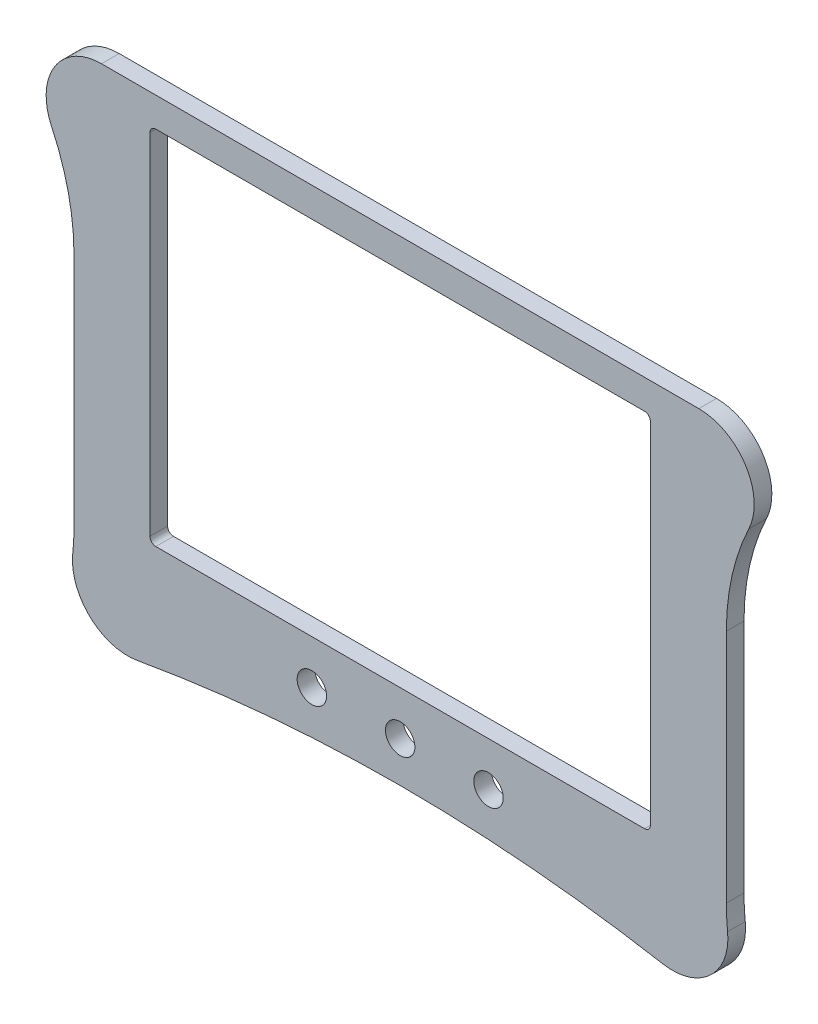
ISO-10303-21;
HEADER;
FILE_DESCRIPTION(('STEP AP214'),'2;1');
FILE_NAME('part.step','',(''),(''),'','','');
FILE_SCHEMA(('AUTOMOTIVE_DESIGN { 1 0 10303 214 1 1 1 1 }'));
ENDSEC;
DATA;
#1=APPLICATION_CONTEXT('core data for automotive mechanical design processes');
#2=APPLICATION_PROTOCOL_DEFINITION('international standard','automotive_design',2000,#1);
#3=PRODUCT_CONTEXT('',#1,'mechanical');
#4=PRODUCT('Part','Part','',(#3));
#5=PRODUCT_RELATED_PRODUCT_CATEGORY('part','',(#4));
#6=PRODUCT_DEFINITION_FORMATION('','',#4);
#7=PRODUCT_DEFINITION_CONTEXT('part definition',#1,'design');
#8=PRODUCT_DEFINITION('design','',#6,#7);
#9=PRODUCT_DEFINITION_SHAPE('','',#8);
#10=(LENGTH_UNIT() NAMED_UNIT(*) SI_UNIT(.MILLI.,.METRE.));
#11=(NAMED_UNIT(*) PLANE_ANGLE_UNIT() SI_UNIT($,.RADIAN.));
#12=(NAMED_UNIT(*) SI_UNIT($,.STERADIAN.) SOLID_ANGLE_UNIT());
#13=UNCERTAINTY_MEASURE_WITH_UNIT(LENGTH_MEASURE(1.E-05),#10,'distance_accuracy_value','');
#14=(GEOMETRIC_REPRESENTATION_CONTEXT(3) GLOBAL_UNCERTAINTY_ASSIGNED_CONTEXT((#13)) GLOBAL_UNIT_ASSIGNED_CONTEXT((#10,
#11,#12)) REPRESENTATION_CONTEXT('',''));
#15=CARTESIAN_POINT('',(0.,0.,0.));
#16=DIRECTION('',(0.,0.,1.));
#17=DIRECTION('',(1.,0.,0.));
#18=AXIS2_PLACEMENT_3D('',#15,#16,#17);
#19=CARTESIAN_POINT('',(120.65,337.34375,3.81));
#20=DIRECTION('',(0.,0.,-1.));
#21=DIRECTION('',(-1.,0.,0.));
#22=AXIS2_PLACEMENT_3D('',#19,#20,#21);
#23=CYLINDRICAL_SURFACE('',#22,50.292);
#24=CARTESIAN_POINT('',(120.65,337.34375,0.));
#25=DIRECTION('',(0.,0.,-1.));
#26=DIRECTION('',(1.,0.,0.));
#27=AXIS2_PLACEMENT_3D('',#24,#25,#26);
#28=CIRCLE('',#27,50.292);
#29=CARTESIAN_POINT('',(70.6285165313798,332.134483679437,0.));
#30=VERTEX_POINT('',#29);
#31=CARTESIAN_POINT('',(70.358,337.34375,0.));
#32=VERTEX_POINT('',#31);
#33=EDGE_CURVE('E243',#30,#32,#28,.T.);
#34=ORIENTED_EDGE('',*,*,#33,.T.);
#35=DIRECTION('',(0.,0.,-1.));
#36=VECTOR('',#35,1.);
#37=CARTESIAN_POINT('',(70.358,337.34375,3.81));
#38=LINE('',#37,#36);
#39=CARTESIAN_POINT('',(70.358,337.34375,3.81));
#40=VERTEX_POINT('',#39);
#41=EDGE_CURVE('E11',#40,#32,#38,.T.);
#42=ORIENTED_EDGE('',*,*,#41,.F.);
#43=CARTESIAN_POINT('',(120.65,337.34375,3.81));
#44=DIRECTION('',(0.,0.,-1.));
#45=DIRECTION('',(1.,0.,0.));
#46=AXIS2_PLACEMENT_3D('',#43,#44,#45);
#47=CIRCLE('',#46,50.292);
#48=CARTESIAN_POINT('',(70.6285165313798,332.134483679437,3.81));
#49=VERTEX_POINT('',#48);
#50=EDGE_CURVE('E248',#49,#40,#47,.T.);
#51=ORIENTED_EDGE('',*,*,#50,.F.);
#52=DIRECTION('',(0.,0.,-1.));
#53=VECTOR('',#52,1.);
#54=CARTESIAN_POINT('',(70.6285165313798,332.134483679437,3.81));
#55=LINE('',#54,#53);
#56=EDGE_CURVE('E274',#49,#30,#55,.T.);
#57=ORIENTED_EDGE('',*,*,#56,.T.);
#58=EDGE_LOOP('',(#34,#42,#51,#57));
#59=FACE_BOUND('',#58,.T.);
#60=ADVANCED_FACE('F33',(#59),#23,.F.);
#61=CARTESIAN_POINT('',(70.358,337.34375,3.81));
#62=DIRECTION('',(-1.,0.,0.));
#63=DIRECTION('',(0.,0.,1.));
#64=AXIS2_PLACEMENT_3D('',#61,#62,#63);
#65=PLANE('',#64);
#66=DIRECTION('',(0.,1.,0.));
#67=VECTOR('',#66,1.);
#68=CARTESIAN_POINT('',(70.358,337.34375,0.));
#69=LINE('',#68,#67);
#70=CARTESIAN_POINT('',(70.358,388.14375,0.));
#71=VERTEX_POINT('',#70);
#72=EDGE_CURVE('E277',#32,#71,#69,.T.);
#73=ORIENTED_EDGE('',*,*,#72,.T.);
#74=DIRECTION('',(0.,0.,-1.));
#75=VECTOR('',#74,1.);
#76=CARTESIAN_POINT('',(70.358,388.14375,3.81));
#77=LINE('',#76,#75);
#78=CARTESIAN_POINT('',(70.358,388.14375,3.81));
#79=VERTEX_POINT('',#78);
#80=EDGE_CURVE('E40',#79,#71,#77,.T.);
#81=ORIENTED_EDGE('',*,*,#80,.F.);
#82=DIRECTION('',(0.,1.,0.));
#83=VECTOR('',#82,1.);
#84=CARTESIAN_POINT('',(70.358,337.34375,3.81));
#85=LINE('',#84,#83);
#86=EDGE_CURVE('E251',#40,#79,#85,.T.);
#87=ORIENTED_EDGE('',*,*,#86,.F.);
#88=ORIENTED_EDGE('',*,*,#41,.T.);
#89=EDGE_LOOP('',(#73,#81,#87,#88));
#90=FACE_BOUND('',#89,.T.);
#91=ADVANCED_FACE('F353',(#90),#65,.F.);
#92=CARTESIAN_POINT('',(120.65,388.14375,3.81));
#93=DIRECTION('',(0.,0.,-1.));
#94=DIRECTION('',(-1.,0.,0.));
#95=AXIS2_PLACEMENT_3D('',#92,#93,#94);
#96=CYLINDRICAL_SURFACE('',#95,50.292);
#97=CARTESIAN_POINT('',(120.65,388.14375,0.));
#98=DIRECTION('',(0.,0.,-1.));
#99=DIRECTION('',(1.,0.,0.));
#100=AXIS2_PLACEMENT_3D('',#97,#98,#99);
#101=CIRCLE('',#100,50.292);
#102=CARTESIAN_POINT('',(75.2107805470892,409.697464285714,0.));
#103=VERTEX_POINT('',#102);
#104=EDGE_CURVE('E279',#71,#103,#101,.T.);
#105=ORIENTED_EDGE('',*,*,#104,.T.);
#106=DIRECTION('',(0.,0.,-1.));
#107=VECTOR('',#106,1.);
#108=CARTESIAN_POINT('',(75.2107805470892,409.697464285714,3.81));
#109=LINE('',#108,#107);
#110=CARTESIAN_POINT('',(75.2107805470892,409.697464285714,3.81));
#111=VERTEX_POINT('',#110);
#112=EDGE_CURVE('E324',#111,#103,#109,.T.);
#113=ORIENTED_EDGE('',*,*,#112,.F.);
#114=CARTESIAN_POINT('',(120.65,388.14375,3.81));
#115=DIRECTION('',(0.,0.,-1.));
#116=DIRECTION('',(1.,0.,0.));
#117=AXIS2_PLACEMENT_3D('',#114,#115,#116);
#118=CIRCLE('',#117,50.292);
#119=EDGE_CURVE('E254',#79,#111,#118,.T.);
#120=ORIENTED_EDGE('',*,*,#119,.F.);
#121=ORIENTED_EDGE('',*,*,#80,.T.);
#122=EDGE_LOOP('',(#105,#113,#120,#121));
#123=FACE_BOUND('',#122,.T.);
#124=ADVANCED_FACE('F331',(#123),#96,.F.);
#125=CARTESIAN_POINT('',(64.4247032022062,414.81375,3.81));
#126=DIRECTION('',(0.,0.,-1.));
#127=DIRECTION('',(-1.,0.,0.));
#128=AXIS2_PLACEMENT_3D('',#125,#126,#127);
#129=CYLINDRICAL_SURFACE('',#128,11.938);
#130=CARTESIAN_POINT('',(64.4247032022062,414.81375,0.));
#131=DIRECTION('',(0.,0.,1.));
#132=DIRECTION('',(1.,0.,0.));
#133=AXIS2_PLACEMENT_3D('',#130,#131,#132);
#134=CIRCLE('',#133,11.938);
#135=CARTESIAN_POINT('',(64.4247032022062,426.75175,0.));
#136=VERTEX_POINT('',#135);
#137=EDGE_CURVE('E281',#103,#136,#134,.T.);
#138=ORIENTED_EDGE('',*,*,#137,.T.);
#139=DIRECTION('',(0.,0.,-1.));
#140=VECTOR('',#139,1.);
#141=CARTESIAN_POINT('',(64.4247032022062,426.75175,3.81));
#142=LINE('',#141,#140);
#143=CARTESIAN_POINT('',(64.4247032022062,426.75175,3.81));
#144=VERTEX_POINT('',#143);
#145=EDGE_CURVE('E321',#144,#136,#142,.T.);
#146=ORIENTED_EDGE('',*,*,#145,.F.);
#147=CARTESIAN_POINT('',(64.4247032022062,414.81375,3.81));
#148=DIRECTION('',(0.,0.,1.));
#149=DIRECTION('',(1.,0.,0.));
#150=AXIS2_PLACEMENT_3D('',#147,#148,#149);
#151=CIRCLE('',#150,11.938);
#152=EDGE_CURVE('E256',#111,#144,#151,.T.);
#153=ORIENTED_EDGE('',*,*,#152,.F.);
#154=ORIENTED_EDGE('',*,*,#112,.T.);
#155=EDGE_LOOP('',(#138,#146,#153,#154));
#156=FACE_BOUND('',#155,.T.);
#157=ADVANCED_FACE('F341',(#156),#129,.T.);
#158=CARTESIAN_POINT('',(64.4247032022062,426.75175,3.81));
#159=DIRECTION('',(0.,-1.,0.));
#160=DIRECTION('',(1.,0.,0.));
#161=AXIS2_PLACEMENT_3D('',#158,#159,#160);
#162=PLANE('',#161);
#163=DIRECTION('',(-1.,0.,0.));
#164=VECTOR('',#163,1.);
#165=CARTESIAN_POINT('',(64.4247032022062,426.75175,0.));
#166=LINE('',#165,#164);
#167=CARTESIAN_POINT('',(-64.4247032022062,426.75175,0.));
#168=VERTEX_POINT('',#167);
#169=EDGE_CURVE('E283',#136,#168,#166,.T.);
#170=ORIENTED_EDGE('',*,*,#169,.T.);
#171=DIRECTION('',(0.,0.,-1.));
#172=VECTOR('',#171,1.);
#173=CARTESIAN_POINT('',(-64.4247032022062,426.75175,3.81));
#174=LINE('',#173,#172);
#175=CARTESIAN_POINT('',(-64.4247032022062,426.75175,3.81));
#176=VERTEX_POINT('',#175);
#177=EDGE_CURVE('E318',#176,#168,#174,.T.);
#178=ORIENTED_EDGE('',*,*,#177,.F.);
#179=DIRECTION('',(-1.,0.,0.));
#180=VECTOR('',#179,1.);
#181=CARTESIAN_POINT('',(64.4247032022062,426.75175,3.81));
#182=LINE('',#181,#180);
#183=EDGE_CURVE('E258',#144,#176,#182,.T.);
#184=ORIENTED_EDGE('',*,*,#183,.F.);
#185=ORIENTED_EDGE('',*,*,#145,.T.);
#186=EDGE_LOOP('',(#170,#178,#184,#185));
#187=FACE_BOUND('',#186,.T.);
#188=ADVANCED_FACE('F345',(#187),#162,.F.);
#189=CARTESIAN_POINT('',(-64.4247032022062,414.81375,3.81));
#190=DIRECTION('',(0.,0.,-1.));
#191=DIRECTION('',(-1.,0.,0.));
#192=AXIS2_PLACEMENT_3D('',#189,#190,#191);
#193=CYLINDRICAL_SURFACE('',#192,11.938);
#194=CARTESIAN_POINT('',(-64.4247032022062,414.81375,0.));
#195=DIRECTION('',(0.,0.,1.));
#196=DIRECTION('',(-1.,0.,0.));
#197=AXIS2_PLACEMENT_3D('',#194,#195,#196);
#198=CIRCLE('',#197,11.938);
#199=CARTESIAN_POINT('',(-75.2107805470892,409.697464285714,0.));
#200=VERTEX_POINT('',#199);
#201=EDGE_CURVE('E285',#168,#200,#198,.T.);
#202=ORIENTED_EDGE('',*,*,#201,.T.);
#203=DIRECTION('',(0.,0.,-1.));
#204=VECTOR('',#203,1.);
#205=CARTESIAN_POINT('',(-75.2107805470892,409.697464285714,3.81));
#206=LINE('',#205,#204);
#207=CARTESIAN_POINT('',(-75.2107805470892,409.697464285714,3.81));
#208=VERTEX_POINT('',#207);
#209=EDGE_CURVE('E315',#208,#200,#206,.T.);
#210=ORIENTED_EDGE('',*,*,#209,.F.);
#211=CARTESIAN_POINT('',(-64.4247032022062,414.81375,3.81));
#212=DIRECTION('',(0.,0.,1.));
#213=DIRECTION('',(-1.,0.,0.));
#214=AXIS2_PLACEMENT_3D('',#211,#212,#213);
#215=CIRCLE('',#214,11.938);
#216=EDGE_CURVE('E260',#176,#208,#215,.T.);
#217=ORIENTED_EDGE('',*,*,#216,.F.);
#218=ORIENTED_EDGE('',*,*,#177,.T.);
#219=EDGE_LOOP('',(#202,#210,#217,#218));
#220=FACE_BOUND('',#219,.T.);
#221=ADVANCED_FACE('F386',(#220),#193,.T.);
#222=CARTESIAN_POINT('',(-120.65,388.14375,3.81));
#223=DIRECTION('',(0.,0.,-1.));
#224=DIRECTION('',(-1.,0.,0.));
#225=AXIS2_PLACEMENT_3D('',#222,#223,#224);
#226=CYLINDRICAL_SURFACE('',#225,50.2919999999999);
#227=CARTESIAN_POINT('',(-120.65,388.14375,0.));
#228=DIRECTION('',(0.,0.,-1.));
#229=DIRECTION('',(1.,0.,0.));
#230=AXIS2_PLACEMENT_3D('',#227,#228,#229);
#231=CIRCLE('',#230,50.2919999999999);
#232=CARTESIAN_POINT('',(-70.358,388.14375,0.));
#233=VERTEX_POINT('',#232);
#234=EDGE_CURVE('E287',#200,#233,#231,.T.);
#235=ORIENTED_EDGE('',*,*,#234,.T.);
#236=DIRECTION('',(0.,0.,-1.));
#237=VECTOR('',#236,1.);
#238=CARTESIAN_POINT('',(-70.358,388.14375,3.81));
#239=LINE('',#238,#237);
#240=CARTESIAN_POINT('',(-70.358,388.14375,3.81));
#241=VERTEX_POINT('',#240);
#242=EDGE_CURVE('E312',#241,#233,#239,.T.);
#243=ORIENTED_EDGE('',*,*,#242,.F.);
#244=CARTESIAN_POINT('',(-120.65,388.14375,3.81));
#245=DIRECTION('',(0.,0.,-1.));
#246=DIRECTION('',(1.,0.,0.));
#247=AXIS2_PLACEMENT_3D('',#244,#245,#246);
#248=CIRCLE('',#247,50.2919999999999);
#249=EDGE_CURVE('E262',#208,#241,#248,.T.);
#250=ORIENTED_EDGE('',*,*,#249,.F.);
#251=ORIENTED_EDGE('',*,*,#209,.T.);
#252=EDGE_LOOP('',(#235,#243,#250,#251));
#253=FACE_BOUND('',#252,.T.);
#254=ADVANCED_FACE('F384',(#253),#226,.F.);
#255=CARTESIAN_POINT('',(-70.358,388.14375,3.81));
#256=DIRECTION('',(1.,0.,0.));
#257=DIRECTION('',(0.,0.,-1.));
#258=AXIS2_PLACEMENT_3D('',#255,#256,#257);
#259=PLANE('',#258);
#260=DIRECTION('',(0.,-1.,0.));
#261=VECTOR('',#260,1.);
#262=CARTESIAN_POINT('',(-70.358,388.14375,0.));
#263=LINE('',#262,#261);
#264=CARTESIAN_POINT('',(-70.358,337.34375,0.));
#265=VERTEX_POINT('',#264);
#266=EDGE_CURVE('E289',#233,#265,#263,.T.);
#267=ORIENTED_EDGE('',*,*,#266,.T.);
#268=DIRECTION('',(0.,0.,-1.));
#269=VECTOR('',#268,1.);
#270=CARTESIAN_POINT('',(-70.358,337.34375,3.81));
#271=LINE('',#270,#269);
#272=CARTESIAN_POINT('',(-70.358,337.34375,3.81));
#273=VERTEX_POINT('',#272);
#274=EDGE_CURVE('E309',#273,#265,#271,.T.);
#275=ORIENTED_EDGE('',*,*,#274,.F.);
#276=DIRECTION('',(0.,-1.,0.));
#277=VECTOR('',#276,1.);
#278=CARTESIAN_POINT('',(-70.358,388.14375,3.81));
#279=LINE('',#278,#277);
#280=EDGE_CURVE('E264',#241,#273,#279,.T.);
#281=ORIENTED_EDGE('',*,*,#280,.F.);
#282=ORIENTED_EDGE('',*,*,#242,.T.);
#283=EDGE_LOOP('',(#267,#275,#281,#282));
#284=FACE_BOUND('',#283,.T.);
#285=ADVANCED_FACE('F380',(#284),#259,.F.);
#286=CARTESIAN_POINT('',(-120.65,337.34375,3.81));
#287=DIRECTION('',(0.,0.,-1.));
#288=DIRECTION('',(-1.,0.,0.));
#289=AXIS2_PLACEMENT_3D('',#286,#287,#288);
#290=CYLINDRICAL_SURFACE('',#289,50.292);
#291=CARTESIAN_POINT('',(-120.65,337.34375,0.));
#292=DIRECTION('',(0.,0.,-1.));
#293=DIRECTION('',(1.,0.,0.));
#294=AXIS2_PLACEMENT_3D('',#291,#292,#293);
#295=CIRCLE('',#294,50.292);
#296=CARTESIAN_POINT('',(-70.6285165313798,332.134483679437,0.));
#297=VERTEX_POINT('',#296);
#298=EDGE_CURVE('E291',#265,#297,#295,.T.);
#299=ORIENTED_EDGE('',*,*,#298,.T.);
#300=DIRECTION('',(0.,0.,-1.));
#301=VECTOR('',#300,1.);
#302=CARTESIAN_POINT('',(-70.6285165313798,332.134483679437,3.81));
#303=LINE('',#302,#301);
#304=CARTESIAN_POINT('',(-70.6285165313798,332.134483679437,3.81));
#305=VERTEX_POINT('',#304);
#306=EDGE_CURVE('E306',#305,#297,#303,.T.);
#307=ORIENTED_EDGE('',*,*,#306,.F.);
#308=CARTESIAN_POINT('',(-120.65,337.34375,3.81));
#309=DIRECTION('',(0.,0.,-1.));
#310=DIRECTION('',(1.,0.,0.));
#311=AXIS2_PLACEMENT_3D('',#308,#309,#310);
#312=CIRCLE('',#311,50.292);
#313=EDGE_CURVE('E266',#273,#305,#312,.T.);
#314=ORIENTED_EDGE('',*,*,#313,.F.);
#315=ORIENTED_EDGE('',*,*,#274,.T.);
#316=EDGE_LOOP('',(#299,#307,#314,#315));
#317=FACE_BOUND('',#316,.T.);
#318=ADVANCED_FACE('F375',(#317),#290,.F.);
#319=CARTESIAN_POINT('',(-58.7547300514547,330.89794066395,3.81));
#320=DIRECTION('',(0.,0.,-1.));
#321=DIRECTION('',(-1.,0.,0.));
#322=AXIS2_PLACEMENT_3D('',#319,#320,#321);
#323=CYLINDRICAL_SURFACE('',#322,11.938);
#324=CARTESIAN_POINT('',(-58.7547300514547,330.89794066395,0.));
#325=DIRECTION('',(0.,0.,1.));
#326=DIRECTION('',(-1.,0.,0.));
#327=AXIS2_PLACEMENT_3D('',#324,#325,#326);
#328=CIRCLE('',#327,11.938);
#329=CARTESIAN_POINT('',(-56.6676465843459,319.143795582264,0.));
#330=VERTEX_POINT('',#329);
#331=EDGE_CURVE('E293',#297,#330,#328,.T.);
#332=ORIENTED_EDGE('',*,*,#331,.T.);
#333=DIRECTION('',(0.,0.,-1.));
#334=VECTOR('',#333,1.);
#335=CARTESIAN_POINT('',(-56.6676465843459,319.143795582264,3.81));
#336=LINE('',#335,#334);
#337=CARTESIAN_POINT('',(-56.6676465843459,319.143795582264,3.81));
#338=VERTEX_POINT('',#337);
#339=EDGE_CURVE('E303',#338,#330,#336,.T.);
#340=ORIENTED_EDGE('',*,*,#339,.F.);
#341=CARTESIAN_POINT('',(-58.7547300514547,330.89794066395,3.81));
#342=DIRECTION('',(0.,0.,1.));
#343=DIRECTION('',(-1.,0.,0.));
#344=AXIS2_PLACEMENT_3D('',#341,#342,#343);
#345=CIRCLE('',#344,11.938);
#346=EDGE_CURVE('E268',#305,#338,#345,.T.);
#347=ORIENTED_EDGE('',*,*,#346,.F.);
#348=ORIENTED_EDGE('',*,*,#306,.T.);
#349=EDGE_LOOP('',(#332,#340,#347,#348));
#350=FACE_BOUND('',#349,.T.);
#351=ADVANCED_FACE('F369',(#350),#323,.T.);
#352=CARTESIAN_POINT('',(0.,0.,3.81));
#353=DIRECTION('',(0.,0.,-1.));
#354=DIRECTION('',(-1.,0.,0.));
#355=AXIS2_PLACEMENT_3D('',#352,#353,#354);
#356=CYLINDRICAL_SURFACE('',#355,324.13575);
#357=CARTESIAN_POINT('',(0.,0.,0.));
#358=DIRECTION('',(0.,0.,-1.));
#359=DIRECTION('',(1.,0.,0.));
#360=AXIS2_PLACEMENT_3D('',#357,#358,#359);
#361=CIRCLE('',#360,324.13575);
#362=CARTESIAN_POINT('',(56.6676465843459,319.143795582264,0.));
#363=VERTEX_POINT('',#362);
#364=EDGE_CURVE('E295',#330,#363,#361,.T.);
#365=ORIENTED_EDGE('',*,*,#364,.T.);
#366=DIRECTION('',(0.,0.,-1.));
#367=VECTOR('',#366,1.);
#368=CARTESIAN_POINT('',(56.6676465843459,319.143795582264,3.81));
#369=LINE('',#368,#367);
#370=CARTESIAN_POINT('',(56.6676465843459,319.143795582264,3.81));
#371=VERTEX_POINT('',#370);
#372=EDGE_CURVE('E300',#371,#363,#369,.T.);
#373=ORIENTED_EDGE('',*,*,#372,.F.);
#374=CARTESIAN_POINT('',(0.,0.,3.81));
#375=DIRECTION('',(0.,0.,-1.));
#376=DIRECTION('',(1.,0.,0.));
#377=AXIS2_PLACEMENT_3D('',#374,#375,#376);
#378=CIRCLE('',#377,324.13575);
#379=EDGE_CURVE('E270',#338,#371,#378,.T.);
#380=ORIENTED_EDGE('',*,*,#379,.F.);
#381=ORIENTED_EDGE('',*,*,#339,.T.);
#382=EDGE_LOOP('',(#365,#373,#380,#381));
#383=FACE_BOUND('',#382,.T.);
#384=ADVANCED_FACE('F365',(#383),#356,.F.);
#385=CARTESIAN_POINT('',(58.7547300514547,330.89794066395,3.81));
#386=DIRECTION('',(0.,0.,-1.));
#387=DIRECTION('',(-1.,0.,0.));
#388=AXIS2_PLACEMENT_3D('',#385,#386,#387);
#389=CYLINDRICAL_SURFACE('',#388,11.938);
#390=CARTESIAN_POINT('',(58.7547300514547,330.89794066395,0.));
#391=DIRECTION('',(0.,0.,1.));
#392=DIRECTION('',(-1.,0.,0.));
#393=AXIS2_PLACEMENT_3D('',#390,#391,#392);
#394=CIRCLE('',#393,11.938);
#395=EDGE_CURVE('E252',#363,#30,#394,.T.);
#396=ORIENTED_EDGE('',*,*,#395,.T.);
#397=ORIENTED_EDGE('',*,*,#56,.F.);
#398=CARTESIAN_POINT('',(58.7547300514547,330.89794066395,3.81));
#399=DIRECTION('',(0.,0.,1.));
#400=DIRECTION('',(-1.,0.,0.));
#401=AXIS2_PLACEMENT_3D('',#398,#399,#400);
#402=CIRCLE('',#401,11.938);
#403=EDGE_CURVE('E272',#371,#49,#402,.T.);
#404=ORIENTED_EDGE('',*,*,#403,.F.);
#405=ORIENTED_EDGE('',*,*,#372,.T.);
#406=EDGE_LOOP('',(#396,#397,#404,#405));
#407=FACE_BOUND('',#406,.T.);
#408=ADVANCED_FACE('F360',(#407),#389,.T.);
#409=CARTESIAN_POINT('',(120.65,337.34375,3.81));
#410=DIRECTION('',(0.,0.,1.));
#411=DIRECTION('',(1.,0.,0.));
#412=AXIS2_PLACEMENT_3D('',#409,#410,#411);
#413=PLANE('',#412);
#414=CARTESIAN_POINT('',(52.705,419.13175,3.81));
#415=DIRECTION('',(0.,0.,1.));
#416=DIRECTION('',(-1.,0.,0.));
#417=AXIS2_PLACEMENT_3D('',#414,#415,#416);
#418=CIRCLE('',#417,1.27);
#419=CARTESIAN_POINT('',(53.975,419.13175,3.81));
#420=VERTEX_POINT('',#419);
#421=CARTESIAN_POINT('',(52.705,420.40175,3.81));
#422=VERTEX_POINT('',#421);
#423=EDGE_CURVE('E47',#420,#422,#418,.T.);
#424=ORIENTED_EDGE('',*,*,#423,.F.);
#425=DIRECTION('',(0.,1.,0.));
#426=VECTOR('',#425,1.);
#427=CARTESIAN_POINT('',(53.975,419.13175,3.81));
#428=LINE('',#427,#426);
#429=CARTESIAN_POINT('',(53.975,343.69375,3.81));
#430=VERTEX_POINT('',#429);
#431=EDGE_CURVE('E188',#430,#420,#428,.T.);
#432=ORIENTED_EDGE('',*,*,#431,.F.);
#433=CARTESIAN_POINT('',(52.705,343.69375,3.81));
#434=DIRECTION('',(0.,0.,1.));
#435=DIRECTION('',(1.,0.,0.));
#436=AXIS2_PLACEMENT_3D('',#433,#434,#435);
#437=CIRCLE('',#436,1.26999999999999);
#438=CARTESIAN_POINT('',(52.705,342.42375,3.81));
#439=VERTEX_POINT('',#438);
#440=EDGE_CURVE('E191',#439,#430,#437,.T.);
#441=ORIENTED_EDGE('',*,*,#440,.F.);
#442=DIRECTION('',(1.,0.,0.));
#443=VECTOR('',#442,1.);
#444=CARTESIAN_POINT('',(-52.705,342.42375,3.81));
#445=LINE('',#444,#443);
#446=CARTESIAN_POINT('',(-52.705,342.42375,3.81));
#447=VERTEX_POINT('',#446);
#448=EDGE_CURVE('E222',#447,#439,#445,.T.);
#449=ORIENTED_EDGE('',*,*,#448,.F.);
#450=CARTESIAN_POINT('',(-52.705,343.69375,3.81));
#451=DIRECTION('',(0.,0.,1.));
#452=DIRECTION('',(1.,0.,0.));
#453=AXIS2_PLACEMENT_3D('',#450,#451,#452);
#454=CIRCLE('',#453,1.27);
#455=CARTESIAN_POINT('',(-53.975,343.69375,3.81));
#456=VERTEX_POINT('',#455);
#457=EDGE_CURVE('E219',#456,#447,#454,.T.);
#458=ORIENTED_EDGE('',*,*,#457,.F.);
#459=DIRECTION('',(0.,-1.,0.));
#460=VECTOR('',#459,1.);
#461=CARTESIAN_POINT('',(-53.975,419.13175,3.81));
#462=LINE('',#461,#460);
#463=CARTESIAN_POINT('',(-53.975,419.13175,3.81));
#464=VERTEX_POINT('',#463);
#465=EDGE_CURVE('E216',#464,#456,#462,.T.);
#466=ORIENTED_EDGE('',*,*,#465,.F.);
#467=CARTESIAN_POINT('',(-52.705,419.13175,3.81));
#468=DIRECTION('',(0.,0.,1.));
#469=DIRECTION('',(1.,0.,0.));
#470=AXIS2_PLACEMENT_3D('',#467,#468,#469);
#471=CIRCLE('',#470,1.27);
#472=CARTESIAN_POINT('',(-52.705,420.40175,3.81));
#473=VERTEX_POINT('',#472);
#474=EDGE_CURVE('E213',#473,#464,#471,.T.);
#475=ORIENTED_EDGE('',*,*,#474,.F.);
#476=DIRECTION('',(-1.,0.,0.));
#477=VECTOR('',#476,1.);
#478=CARTESIAN_POINT('',(-52.705,420.40175,3.81));
#479=LINE('',#478,#477);
#480=EDGE_CURVE('E211',#422,#473,#479,.T.);
#481=ORIENTED_EDGE('',*,*,#480,.F.);
#482=EDGE_LOOP('',(#424,#432,#441,#449,#458,#466,#475,#481));
#483=FACE_BOUND('',#482,.T.);
#484=CARTESIAN_POINT('',(19.05,332.89875,3.81));
#485=DIRECTION('',(0.,0.,1.));
#486=DIRECTION('',(1.,0.,0.));
#487=AXIS2_PLACEMENT_3D('',#484,#485,#486);
#488=CIRCLE('',#487,3.17500000000003);
#489=CARTESIAN_POINT('',(22.225,332.89875,3.81));
#490=VERTEX_POINT('',#489);
#491=EDGE_CURVE('E194',#490,#490,#488,.T.);
#492=ORIENTED_EDGE('',*,*,#491,.F.);
#493=EDGE_LOOP('',(#492));
#494=FACE_BOUND('',#493,.T.);
#495=CARTESIAN_POINT('',(0.,332.89875,3.81));
#496=DIRECTION('',(0.,0.,1.));
#497=DIRECTION('',(1.,0.,0.));
#498=AXIS2_PLACEMENT_3D('',#495,#496,#497);
#499=CIRCLE('',#498,3.17500000000003);
#500=CARTESIAN_POINT('',(3.17500000000003,332.89875,3.81));
#501=VERTEX_POINT('',#500);
#502=EDGE_CURVE('E606',#501,#501,#499,.T.);
#503=ORIENTED_EDGE('',*,*,#502,.F.);
#504=EDGE_LOOP('',(#503));
#505=FACE_BOUND('',#504,.T.);
#506=CARTESIAN_POINT('',(-19.05,332.89875,3.81));
#507=DIRECTION('',(0.,0.,1.));
#508=DIRECTION('',(1.,0.,0.));
#509=AXIS2_PLACEMENT_3D('',#506,#507,#508);
#510=CIRCLE('',#509,3.175);
#511=CARTESIAN_POINT('',(-15.875,332.89875,3.81));
#512=VERTEX_POINT('',#511);
#513=EDGE_CURVE('E244',#512,#512,#510,.T.);
#514=ORIENTED_EDGE('',*,*,#513,.F.);
#515=EDGE_LOOP('',(#514));
#516=FACE_BOUND('',#515,.T.);
#517=ORIENTED_EDGE('',*,*,#50,.T.);
#518=ORIENTED_EDGE('',*,*,#86,.T.);
#519=ORIENTED_EDGE('',*,*,#119,.T.);
#520=ORIENTED_EDGE('',*,*,#152,.T.);
#521=ORIENTED_EDGE('',*,*,#183,.T.);
#522=ORIENTED_EDGE('',*,*,#216,.T.);
#523=ORIENTED_EDGE('',*,*,#249,.T.);
#524=ORIENTED_EDGE('',*,*,#280,.T.);
#525=ORIENTED_EDGE('',*,*,#313,.T.);
#526=ORIENTED_EDGE('',*,*,#346,.T.);
#527=ORIENTED_EDGE('',*,*,#379,.T.);
#528=ORIENTED_EDGE('',*,*,#403,.T.);
#529=EDGE_LOOP('',(#517,#518,#519,#520,#521,#522,#523,#524,#525,#526,#527,#528));
#530=FACE_BOUND('',#529,.T.);
#531=ADVANCED_FACE('F349',(#483,#494,#505,#516,#530),#413,.T.);
#532=CARTESIAN_POINT('',(120.65,337.34375,0.));
#533=DIRECTION('',(0.,0.,1.));
#534=DIRECTION('',(1.,0.,0.));
#535=AXIS2_PLACEMENT_3D('',#532,#533,#534);
#536=PLANE('',#535);
#537=DIRECTION('',(0.,1.,0.));
#538=VECTOR('',#537,1.);
#539=CARTESIAN_POINT('',(53.975,419.13175,0.));
#540=LINE('',#539,#538);
#541=CARTESIAN_POINT('',(53.975,343.69375,0.));
#542=VERTEX_POINT('',#541);
#543=CARTESIAN_POINT('',(53.975,419.13175,0.));
#544=VERTEX_POINT('',#543);
#545=EDGE_CURVE('E177',#542,#544,#540,.T.);
#546=ORIENTED_EDGE('',*,*,#545,.T.);
#547=CARTESIAN_POINT('',(52.705,419.13175,0.));
#548=DIRECTION('',(0.,0.,1.));
#549=DIRECTION('',(-1.,0.,0.));
#550=AXIS2_PLACEMENT_3D('',#547,#548,#549);
#551=CIRCLE('',#550,1.27);
#552=CARTESIAN_POINT('',(52.705,420.40175,0.));
#553=VERTEX_POINT('',#552);
#554=EDGE_CURVE('E171',#544,#553,#551,.T.);
#555=ORIENTED_EDGE('',*,*,#554,.T.);
#556=DIRECTION('',(-1.,0.,0.));
#557=VECTOR('',#556,1.);
#558=CARTESIAN_POINT('',(-52.705,420.40175,0.));
#559=LINE('',#558,#557);
#560=CARTESIAN_POINT('',(-52.705,420.40175,0.));
#561=VERTEX_POINT('',#560);
#562=EDGE_CURVE('E180',#553,#561,#559,.T.);
#563=ORIENTED_EDGE('',*,*,#562,.T.);
#564=CARTESIAN_POINT('',(-52.705,419.13175,0.));
#565=DIRECTION('',(0.,0.,1.));
#566=DIRECTION('',(1.,0.,0.));
#567=AXIS2_PLACEMENT_3D('',#564,#565,#566);
#568=CIRCLE('',#567,1.27);
#569=CARTESIAN_POINT('',(-53.975,419.13175,0.));
#570=VERTEX_POINT('',#569);
#571=EDGE_CURVE('E55',#561,#570,#568,.T.);
#572=ORIENTED_EDGE('',*,*,#571,.T.);
#573=DIRECTION('',(0.,-1.,0.));
#574=VECTOR('',#573,1.);
#575=CARTESIAN_POINT('',(-53.975,419.13175,0.));
#576=LINE('',#575,#574);
#577=CARTESIAN_POINT('',(-53.975,343.69375,0.));
#578=VERTEX_POINT('',#577);
#579=EDGE_CURVE('E198',#570,#578,#576,.T.);
#580=ORIENTED_EDGE('',*,*,#579,.T.);
#581=CARTESIAN_POINT('',(-52.705,343.69375,0.));
#582=DIRECTION('',(0.,0.,1.));
#583=DIRECTION('',(1.,0.,0.));
#584=AXIS2_PLACEMENT_3D('',#581,#582,#583);
#585=CIRCLE('',#584,1.27);
#586=CARTESIAN_POINT('',(-52.705,342.42375,0.));
#587=VERTEX_POINT('',#586);
#588=EDGE_CURVE('E201',#578,#587,#585,.T.);
#589=ORIENTED_EDGE('',*,*,#588,.T.);
#590=DIRECTION('',(1.,0.,0.));
#591=VECTOR('',#590,1.);
#592=CARTESIAN_POINT('',(-52.705,342.42375,0.));
#593=LINE('',#592,#591);
#594=CARTESIAN_POINT('',(52.705,342.42375,0.));
#595=VERTEX_POINT('',#594);
#596=EDGE_CURVE('E204',#587,#595,#593,.T.);
#597=ORIENTED_EDGE('',*,*,#596,.T.);
#598=CARTESIAN_POINT('',(52.705,343.69375,0.));
#599=DIRECTION('',(0.,0.,1.));
#600=DIRECTION('',(1.,0.,0.));
#601=AXIS2_PLACEMENT_3D('',#598,#599,#600);
#602=CIRCLE('',#601,1.26999999999999);
#603=EDGE_CURVE('E207',#595,#542,#602,.T.);
#604=ORIENTED_EDGE('',*,*,#603,.T.);
#605=EDGE_LOOP('',(#546,#555,#563,#572,#580,#589,#597,#604));
#606=FACE_BOUND('',#605,.T.);
#607=CARTESIAN_POINT('',(19.05,332.89875,0.));
#608=DIRECTION('',(0.,0.,1.));
#609=DIRECTION('',(1.,0.,0.));
#610=AXIS2_PLACEMENT_3D('',#607,#608,#609);
#611=CIRCLE('',#610,3.17500000000003);
#612=CARTESIAN_POINT('',(22.225,332.89875,0.));
#613=VERTEX_POINT('',#612);
#614=EDGE_CURVE('E610',#613,#613,#611,.T.);
#615=ORIENTED_EDGE('',*,*,#614,.T.);
#616=EDGE_LOOP('',(#615));
#617=FACE_BOUND('',#616,.T.);
#618=CARTESIAN_POINT('',(0.,332.89875,0.));
#619=DIRECTION('',(0.,0.,1.));
#620=DIRECTION('',(1.,0.,0.));
#621=AXIS2_PLACEMENT_3D('',#618,#619,#620);
#622=CIRCLE('',#621,3.17500000000003);
#623=CARTESIAN_POINT('',(3.17500000000003,332.89875,0.));
#624=VERTEX_POINT('',#623);
#625=EDGE_CURVE('E247',#624,#624,#622,.T.);
#626=ORIENTED_EDGE('',*,*,#625,.T.);
#627=EDGE_LOOP('',(#626));
#628=FACE_BOUND('',#627,.T.);
#629=CARTESIAN_POINT('',(-19.05,332.89875,0.));
#630=DIRECTION('',(0.,0.,1.));
#631=DIRECTION('',(1.,0.,0.));
#632=AXIS2_PLACEMENT_3D('',#629,#630,#631);
#633=CIRCLE('',#632,3.175);
#634=CARTESIAN_POINT('',(-15.875,332.89875,0.));
#635=VERTEX_POINT('',#634);
#636=EDGE_CURVE('E240',#635,#635,#633,.T.);
#637=ORIENTED_EDGE('',*,*,#636,.T.);
#638=EDGE_LOOP('',(#637));
#639=FACE_BOUND('',#638,.T.);
#640=ORIENTED_EDGE('',*,*,#33,.F.);
#641=ORIENTED_EDGE('',*,*,#395,.F.);
#642=ORIENTED_EDGE('',*,*,#364,.F.);
#643=ORIENTED_EDGE('',*,*,#331,.F.);
#644=ORIENTED_EDGE('',*,*,#298,.F.);
#645=ORIENTED_EDGE('',*,*,#266,.F.);
#646=ORIENTED_EDGE('',*,*,#234,.F.);
#647=ORIENTED_EDGE('',*,*,#201,.F.);
#648=ORIENTED_EDGE('',*,*,#169,.F.);
#649=ORIENTED_EDGE('',*,*,#137,.F.);
#650=ORIENTED_EDGE('',*,*,#104,.F.);
#651=ORIENTED_EDGE('',*,*,#72,.F.);
#652=EDGE_LOOP('',(#640,#641,#642,#643,#644,#645,#646,#647,#648,#649,#650,#651));
#653=FACE_BOUND('',#652,.T.);
#654=ADVANCED_FACE('F184',(#606,#617,#628,#639,#653),#536,.F.);
#655=CARTESIAN_POINT('',(-19.05,332.89875,0.));
#656=DIRECTION('',(0.,0.,1.));
#657=DIRECTION('',(1.,0.,0.));
#658=AXIS2_PLACEMENT_3D('',#655,#656,#657);
#659=CYLINDRICAL_SURFACE('',#658,3.175);
#660=CARTESIAN_POINT('',(-15.875,332.89875,0.));
#661=CARTESIAN_POINT('',(-15.875,332.89875,0.0396874999999999));
#662=CARTESIAN_POINT('',(-15.875,332.89875,0.079375));
#663=CARTESIAN_POINT('',(-15.875,332.89875,0.15875));
#664=CARTESIAN_POINT('',(-15.875,332.89875,0.1984375));
#665=CARTESIAN_POINT('',(-15.875,332.89875,0.2778125));
#666=CARTESIAN_POINT('',(-15.875,332.89875,0.3175));
#667=CARTESIAN_POINT('',(-15.875,332.89875,0.396875));
#668=CARTESIAN_POINT('',(-15.875,332.89875,0.4365625));
#669=CARTESIAN_POINT('',(-15.875,332.89875,0.5159375));
#670=CARTESIAN_POINT('',(-15.875,332.89875,0.555625));
#671=CARTESIAN_POINT('',(-15.875,332.89875,0.635));
#672=CARTESIAN_POINT('',(-15.875,332.89875,0.6746875));
#673=CARTESIAN_POINT('',(-15.875,332.89875,0.7540625));
#674=CARTESIAN_POINT('',(-15.875,332.89875,0.79375));
#675=CARTESIAN_POINT('',(-15.875,332.89875,0.873125));
#676=CARTESIAN_POINT('',(-15.875,332.89875,0.9128125));
#677=CARTESIAN_POINT('',(-15.875,332.89875,0.9921875));
#678=CARTESIAN_POINT('',(-15.875,332.89875,1.031875));
#679=CARTESIAN_POINT('',(-15.875,332.89875,1.11125));
#680=CARTESIAN_POINT('',(-15.875,332.89875,1.1509375));
#681=CARTESIAN_POINT('',(-15.875,332.89875,1.2303125));
#682=CARTESIAN_POINT('',(-15.875,332.89875,1.27));
#683=CARTESIAN_POINT('',(-15.875,332.89875,1.349375));
#684=CARTESIAN_POINT('',(-15.875,332.89875,1.3890625));
#685=CARTESIAN_POINT('',(-15.875,332.89875,1.4684375));
#686=CARTESIAN_POINT('',(-15.875,332.89875,1.508125));
#687=CARTESIAN_POINT('',(-15.875,332.89875,1.5875));
#688=CARTESIAN_POINT('',(-15.875,332.89875,1.6271875));
#689=CARTESIAN_POINT('',(-15.875,332.89875,1.7065625));
#690=CARTESIAN_POINT('',(-15.875,332.89875,1.74625));
#691=CARTESIAN_POINT('',(-15.875,332.89875,1.825625));
#692=CARTESIAN_POINT('',(-15.875,332.89875,1.8653125));
#693=CARTESIAN_POINT('',(-15.875,332.89875,1.9446875));
#694=CARTESIAN_POINT('',(-15.875,332.89875,1.984375));
#695=CARTESIAN_POINT('',(-15.875,332.89875,2.06375));
#696=CARTESIAN_POINT('',(-15.875,332.89875,2.1034375));
#697=CARTESIAN_POINT('',(-15.875,332.89875,2.1828125));
#698=CARTESIAN_POINT('',(-15.875,332.89875,2.2225));
#699=CARTESIAN_POINT('',(-15.875,332.89875,2.301875));
#700=CARTESIAN_POINT('',(-15.875,332.89875,2.3415625));
#701=CARTESIAN_POINT('',(-15.875,332.89875,2.4209375));
#702=CARTESIAN_POINT('',(-15.875,332.89875,2.460625));
#703=CARTESIAN_POINT('',(-15.875,332.89875,2.54));
#704=CARTESIAN_POINT('',(-15.875,332.89875,2.5796875));
#705=CARTESIAN_POINT('',(-15.875,332.89875,2.6590625));
#706=CARTESIAN_POINT('',(-15.875,332.89875,2.69875));
#707=CARTESIAN_POINT('',(-15.875,332.89875,2.778125));
#708=CARTESIAN_POINT('',(-15.875,332.89875,2.8178125));
#709=CARTESIAN_POINT('',(-15.875,332.89875,2.8971875));
#710=CARTESIAN_POINT('',(-15.875,332.89875,2.936875));
#711=CARTESIAN_POINT('',(-15.875,332.89875,3.01625));
#712=CARTESIAN_POINT('',(-15.875,332.89875,3.0559375));
#713=CARTESIAN_POINT('',(-15.875,332.89875,3.1353125));
#714=CARTESIAN_POINT('',(-15.875,332.89875,3.175));
#715=CARTESIAN_POINT('',(-15.875,332.89875,3.254375));
#716=CARTESIAN_POINT('',(-15.875,332.89875,3.2940625));
#717=CARTESIAN_POINT('',(-15.875,332.89875,3.3734375));
#718=CARTESIAN_POINT('',(-15.875,332.89875,3.413125));
#719=CARTESIAN_POINT('',(-15.875,332.89875,3.4925));
#720=CARTESIAN_POINT('',(-15.875,332.89875,3.5321875));
#721=CARTESIAN_POINT('',(-15.875,332.89875,3.6115625));
#722=CARTESIAN_POINT('',(-15.875,332.89875,3.65125));
#723=CARTESIAN_POINT('',(-15.875,332.89875,3.730625));
#724=CARTESIAN_POINT('',(-15.875,332.89875,3.7703125));
#725=CARTESIAN_POINT('',(-15.875,332.89875,3.81));
#726=B_SPLINE_CURVE_WITH_KNOTS('',3,(#660,#661,#662,#663,#664,#665,#666,#667,#668,#669,#670,
#671,#672,#673,#674,#675,#676,#677,#678,#679,#680,#681,#682,#683,#684,#685,#686,#687,#688,#689,
#690,#691,#692,#693,#694,#695,#696,#697,#698,#699,#700,#701,#702,#703,#704,#705,#706,#707,#708,
#709,#710,#711,#712,#713,#714,#715,#716,#717,#718,#719,#720,#721,#722,#723,#724,#725),
.UNSPECIFIED.,.F.,.F.,(4,2,2,2,2,2,2,2,2,2,2,2,2,2,2,2,2,2,2,2,2,2,2,2,2,2,2,2,2,2,2,2,4),(0.,
0.1190625,0.238125,0.3571875,0.47625,0.5953125,0.714375,0.8334375,0.9525,1.0715625,1.190625,
1.3096875,1.42875,1.5478125,1.666875,1.7859375,1.905,2.0240625,2.143125,2.2621875,2.38125,
2.5003125,2.619375,2.7384375,2.8575,2.9765625,3.095625,3.2146875,3.33375,3.4528125,3.571875,
3.6909375,3.81),.UNSPECIFIED.);
#727=EDGE_CURVE('BSEAM481',#635,#512,#726,.T.);
#728=ORIENTED_EDGE('',*,*,#636,.F.);
#729=ORIENTED_EDGE('',*,*,#513,.T.);
#730=ORIENTED_EDGE('',*,*,#727,.T.);
#731=ORIENTED_EDGE('',*,*,#727,.F.);
#732=EDGE_LOOP('',(#728,#730,#729,#731));
#733=FACE_BOUND('',#732,.T.);
#734=ADVANCED_FACE('F481',(#733),#659,.F.);
#735=CARTESIAN_POINT('',(0.,332.89875,0.));
#736=DIRECTION('',(0.,0.,1.));
#737=DIRECTION('',(1.,0.,0.));
#738=AXIS2_PLACEMENT_3D('',#735,#736,#737);
#739=CYLINDRICAL_SURFACE('',#738,3.17500000000003);
#740=CARTESIAN_POINT('',(3.17500000000003,332.89875,0.));
#741=CARTESIAN_POINT('',(3.17500000000003,332.89875,0.0396874999999999));
#742=CARTESIAN_POINT('',(3.17500000000003,332.89875,0.079375));
#743=CARTESIAN_POINT('',(3.17500000000003,332.89875,0.15875));
#744=CARTESIAN_POINT('',(3.17500000000003,332.89875,0.1984375));
#745=CARTESIAN_POINT('',(3.17500000000003,332.89875,0.2778125));
#746=CARTESIAN_POINT('',(3.17500000000003,332.89875,0.3175));
#747=CARTESIAN_POINT('',(3.17500000000003,332.89875,0.396875));
#748=CARTESIAN_POINT('',(3.17500000000003,332.89875,0.4365625));
#749=CARTESIAN_POINT('',(3.17500000000003,332.89875,0.5159375));
#750=CARTESIAN_POINT('',(3.17500000000003,332.89875,0.555625));
#751=CARTESIAN_POINT('',(3.17500000000003,332.89875,0.635));
#752=CARTESIAN_POINT('',(3.17500000000003,332.89875,0.6746875));
#753=CARTESIAN_POINT('',(3.17500000000003,332.89875,0.7540625));
#754=CARTESIAN_POINT('',(3.17500000000003,332.89875,0.79375));
#755=CARTESIAN_POINT('',(3.17500000000003,332.89875,0.873125));
#756=CARTESIAN_POINT('',(3.17500000000003,332.89875,0.9128125));
#757=CARTESIAN_POINT('',(3.17500000000003,332.89875,0.9921875));
#758=CARTESIAN_POINT('',(3.17500000000003,332.89875,1.031875));
#759=CARTESIAN_POINT('',(3.17500000000003,332.89875,1.11125));
#760=CARTESIAN_POINT('',(3.17500000000003,332.89875,1.1509375));
#761=CARTESIAN_POINT('',(3.17500000000003,332.89875,1.2303125));
#762=CARTESIAN_POINT('',(3.17500000000003,332.89875,1.27));
#763=CARTESIAN_POINT('',(3.17500000000003,332.89875,1.349375));
#764=CARTESIAN_POINT('',(3.17500000000003,332.89875,1.3890625));
#765=CARTESIAN_POINT('',(3.17500000000003,332.89875,1.4684375));
#766=CARTESIAN_POINT('',(3.17500000000003,332.89875,1.508125));
#767=CARTESIAN_POINT('',(3.17500000000003,332.89875,1.5875));
#768=CARTESIAN_POINT('',(3.17500000000003,332.89875,1.6271875));
#769=CARTESIAN_POINT('',(3.17500000000003,332.89875,1.7065625));
#770=CARTESIAN_POINT('',(3.17500000000003,332.89875,1.74625));
#771=CARTESIAN_POINT('',(3.17500000000003,332.89875,1.825625));
#772=CARTESIAN_POINT('',(3.17500000000003,332.89875,1.8653125));
#773=CARTESIAN_POINT('',(3.17500000000003,332.89875,1.9446875));
#774=CARTESIAN_POINT('',(3.17500000000003,332.89875,1.984375));
#775=CARTESIAN_POINT('',(3.17500000000003,332.89875,2.06375));
#776=CARTESIAN_POINT('',(3.17500000000003,332.89875,2.1034375));
#777=CARTESIAN_POINT('',(3.17500000000003,332.89875,2.1828125));
#778=CARTESIAN_POINT('',(3.17500000000003,332.89875,2.2225));
#779=CARTESIAN_POINT('',(3.17500000000003,332.89875,2.301875));
#780=CARTESIAN_POINT('',(3.17500000000003,332.89875,2.3415625));
#781=CARTESIAN_POINT('',(3.17500000000003,332.89875,2.4209375));
#782=CARTESIAN_POINT('',(3.17500000000003,332.89875,2.460625));
#783=CARTESIAN_POINT('',(3.17500000000003,332.89875,2.54));
#784=CARTESIAN_POINT('',(3.17500000000003,332.89875,2.5796875));
#785=CARTESIAN_POINT('',(3.17500000000003,332.89875,2.6590625));
#786=CARTESIAN_POINT('',(3.17500000000003,332.89875,2.69875));
#787=CARTESIAN_POINT('',(3.17500000000003,332.89875,2.778125));
#788=CARTESIAN_POINT('',(3.17500000000003,332.89875,2.8178125));
#789=CARTESIAN_POINT('',(3.17500000000003,332.89875,2.8971875));
#790=CARTESIAN_POINT('',(3.17500000000003,332.89875,2.936875));
#791=CARTESIAN_POINT('',(3.17500000000003,332.89875,3.01625));
#792=CARTESIAN_POINT('',(3.17500000000003,332.89875,3.0559375));
#793=CARTESIAN_POINT('',(3.17500000000003,332.89875,3.1353125));
#794=CARTESIAN_POINT('',(3.17500000000003,332.89875,3.175));
#795=CARTESIAN_POINT('',(3.17500000000003,332.89875,3.254375));
#796=CARTESIAN_POINT('',(3.17500000000003,332.89875,3.2940625));
#797=CARTESIAN_POINT('',(3.17500000000003,332.89875,3.3734375));
#798=CARTESIAN_POINT('',(3.17500000000003,332.89875,3.413125));
#799=CARTESIAN_POINT('',(3.17500000000003,332.89875,3.4925));
#800=CARTESIAN_POINT('',(3.17500000000003,332.89875,3.5321875));
#801=CARTESIAN_POINT('',(3.17500000000003,332.89875,3.6115625));
#802=CARTESIAN_POINT('',(3.17500000000003,332.89875,3.65125));
#803=CARTESIAN_POINT('',(3.17500000000003,332.89875,3.730625));
#804=CARTESIAN_POINT('',(3.17500000000003,332.89875,3.7703125));
#805=CARTESIAN_POINT('',(3.17500000000003,332.89875,3.81));
#806=B_SPLINE_CURVE_WITH_KNOTS('',3,(#740,#741,#742,#743,#744,#745,#746,#747,#748,#749,#750,
#751,#752,#753,#754,#755,#756,#757,#758,#759,#760,#761,#762,#763,#764,#765,#766,#767,#768,#769,
#770,#771,#772,#773,#774,#775,#776,#777,#778,#779,#780,#781,#782,#783,#784,#785,#786,#787,#788,
#789,#790,#791,#792,#793,#794,#795,#796,#797,#798,#799,#800,#801,#802,#803,#804,#805),
.UNSPECIFIED.,.F.,.F.,(4,2,2,2,2,2,2,2,2,2,2,2,2,2,2,2,2,2,2,2,2,2,2,2,2,2,2,2,2,2,2,2,4),(0.,
0.1190625,0.238125,0.3571875,0.47625,0.5953125,0.714375,0.8334375,0.9525,1.0715625,1.190625,
1.3096875,1.42875,1.5478125,1.666875,1.7859375,1.905,2.0240625,2.143125,2.2621875,2.38125,
2.5003125,2.619375,2.7384375,2.8575,2.9765625,3.095625,3.2146875,3.33375,3.4528125,3.571875,
3.6909375,3.81),.UNSPECIFIED.);
#807=EDGE_CURVE('BSEAM490',#624,#501,#806,.T.);
#808=ORIENTED_EDGE('',*,*,#625,.F.);
#809=ORIENTED_EDGE('',*,*,#502,.T.);
#810=ORIENTED_EDGE('',*,*,#807,.T.);
#811=ORIENTED_EDGE('',*,*,#807,.F.);
#812=EDGE_LOOP('',(#808,#810,#809,#811));
#813=FACE_BOUND('',#812,.T.);
#814=ADVANCED_FACE('F490',(#813),#739,.F.);
#815=CARTESIAN_POINT('',(19.05,332.89875,0.));
#816=DIRECTION('',(0.,0.,1.));
#817=DIRECTION('',(1.,0.,0.));
#818=AXIS2_PLACEMENT_3D('',#815,#816,#817);
#819=CYLINDRICAL_SURFACE('',#818,3.17500000000003);
#820=CARTESIAN_POINT('',(22.225,332.89875,0.));
#821=CARTESIAN_POINT('',(22.225,332.89875,0.0396874999999999));
#822=CARTESIAN_POINT('',(22.225,332.89875,0.079375));
#823=CARTESIAN_POINT('',(22.225,332.89875,0.15875));
#824=CARTESIAN_POINT('',(22.225,332.89875,0.1984375));
#825=CARTESIAN_POINT('',(22.225,332.89875,0.2778125));
#826=CARTESIAN_POINT('',(22.225,332.89875,0.3175));
#827=CARTESIAN_POINT('',(22.225,332.89875,0.396875));
#828=CARTESIAN_POINT('',(22.225,332.89875,0.4365625));
#829=CARTESIAN_POINT('',(22.225,332.89875,0.5159375));
#830=CARTESIAN_POINT('',(22.225,332.89875,0.555625));
#831=CARTESIAN_POINT('',(22.225,332.89875,0.635));
#832=CARTESIAN_POINT('',(22.225,332.89875,0.6746875));
#833=CARTESIAN_POINT('',(22.225,332.89875,0.7540625));
#834=CARTESIAN_POINT('',(22.225,332.89875,0.79375));
#835=CARTESIAN_POINT('',(22.225,332.89875,0.873125));
#836=CARTESIAN_POINT('',(22.225,332.89875,0.9128125));
#837=CARTESIAN_POINT('',(22.225,332.89875,0.9921875));
#838=CARTESIAN_POINT('',(22.225,332.89875,1.031875));
#839=CARTESIAN_POINT('',(22.225,332.89875,1.11125));
#840=CARTESIAN_POINT('',(22.225,332.89875,1.1509375));
#841=CARTESIAN_POINT('',(22.225,332.89875,1.2303125));
#842=CARTESIAN_POINT('',(22.225,332.89875,1.27));
#843=CARTESIAN_POINT('',(22.225,332.89875,1.349375));
#844=CARTESIAN_POINT('',(22.225,332.89875,1.3890625));
#845=CARTESIAN_POINT('',(22.225,332.89875,1.4684375));
#846=CARTESIAN_POINT('',(22.225,332.89875,1.508125));
#847=CARTESIAN_POINT('',(22.225,332.89875,1.5875));
#848=CARTESIAN_POINT('',(22.225,332.89875,1.6271875));
#849=CARTESIAN_POINT('',(22.225,332.89875,1.7065625));
#850=CARTESIAN_POINT('',(22.225,332.89875,1.74625));
#851=CARTESIAN_POINT('',(22.225,332.89875,1.825625));
#852=CARTESIAN_POINT('',(22.225,332.89875,1.8653125));
#853=CARTESIAN_POINT('',(22.225,332.89875,1.9446875));
#854=CARTESIAN_POINT('',(22.225,332.89875,1.984375));
#855=CARTESIAN_POINT('',(22.225,332.89875,2.06375));
#856=CARTESIAN_POINT('',(22.225,332.89875,2.1034375));
#857=CARTESIAN_POINT('',(22.225,332.89875,2.1828125));
#858=CARTESIAN_POINT('',(22.225,332.89875,2.2225));
#859=CARTESIAN_POINT('',(22.225,332.89875,2.301875));
#860=CARTESIAN_POINT('',(22.225,332.89875,2.3415625));
#861=CARTESIAN_POINT('',(22.225,332.89875,2.4209375));
#862=CARTESIAN_POINT('',(22.225,332.89875,2.460625));
#863=CARTESIAN_POINT('',(22.225,332.89875,2.54));
#864=CARTESIAN_POINT('',(22.225,332.89875,2.5796875));
#865=CARTESIAN_POINT('',(22.225,332.89875,2.6590625));
#866=CARTESIAN_POINT('',(22.225,332.89875,2.69875));
#867=CARTESIAN_POINT('',(22.225,332.89875,2.778125));
#868=CARTESIAN_POINT('',(22.225,332.89875,2.8178125));
#869=CARTESIAN_POINT('',(22.225,332.89875,2.8971875));
#870=CARTESIAN_POINT('',(22.225,332.89875,2.936875));
#871=CARTESIAN_POINT('',(22.225,332.89875,3.01625));
#872=CARTESIAN_POINT('',(22.225,332.89875,3.0559375));
#873=CARTESIAN_POINT('',(22.225,332.89875,3.1353125));
#874=CARTESIAN_POINT('',(22.225,332.89875,3.175));
#875=CARTESIAN_POINT('',(22.225,332.89875,3.254375));
#876=CARTESIAN_POINT('',(22.225,332.89875,3.2940625));
#877=CARTESIAN_POINT('',(22.225,332.89875,3.3734375));
#878=CARTESIAN_POINT('',(22.225,332.89875,3.413125));
#879=CARTESIAN_POINT('',(22.225,332.89875,3.4925));
#880=CARTESIAN_POINT('',(22.225,332.89875,3.5321875));
#881=CARTESIAN_POINT('',(22.225,332.89875,3.6115625));
#882=CARTESIAN_POINT('',(22.225,332.89875,3.65125));
#883=CARTESIAN_POINT('',(22.225,332.89875,3.730625));
#884=CARTESIAN_POINT('',(22.225,332.89875,3.7703125));
#885=CARTESIAN_POINT('',(22.225,332.89875,3.81));
#886=B_SPLINE_CURVE_WITH_KNOTS('',3,(#820,#821,#822,#823,#824,#825,#826,#827,#828,#829,#830,
#831,#832,#833,#834,#835,#836,#837,#838,#839,#840,#841,#842,#843,#844,#845,#846,#847,#848,#849,
#850,#851,#852,#853,#854,#855,#856,#857,#858,#859,#860,#861,#862,#863,#864,#865,#866,#867,#868,
#869,#870,#871,#872,#873,#874,#875,#876,#877,#878,#879,#880,#881,#882,#883,#884,#885),
.UNSPECIFIED.,.F.,.F.,(4,2,2,2,2,2,2,2,2,2,2,2,2,2,2,2,2,2,2,2,2,2,2,2,2,2,2,2,2,2,2,2,4),(0.,
0.1190625,0.238125,0.3571875,0.47625,0.5953125,0.714375,0.8334375,0.9525,1.0715625,1.190625,
1.3096875,1.42875,1.5478125,1.666875,1.7859375,1.905,2.0240625,2.143125,2.2621875,2.38125,
2.5003125,2.619375,2.7384375,2.8575,2.9765625,3.095625,3.2146875,3.33375,3.4528125,3.571875,
3.6909375,3.81),.UNSPECIFIED.);
#887=EDGE_CURVE('BSEAM500',#613,#490,#886,.T.);
#888=ORIENTED_EDGE('',*,*,#614,.F.);
#889=ORIENTED_EDGE('',*,*,#491,.T.);
#890=ORIENTED_EDGE('',*,*,#887,.T.);
#891=ORIENTED_EDGE('',*,*,#887,.F.);
#892=EDGE_LOOP('',(#888,#890,#889,#891));
#893=FACE_BOUND('',#892,.T.);
#894=ADVANCED_FACE('F500',(#893),#819,.F.);
#895=CARTESIAN_POINT('',(52.705,419.13175,0.));
#896=DIRECTION('',(0.,0.,1.));
#897=DIRECTION('',(1.,0.,0.));
#898=AXIS2_PLACEMENT_3D('',#895,#896,#897);
#899=CYLINDRICAL_SURFACE('',#898,1.27);
#900=ORIENTED_EDGE('',*,*,#423,.T.);
#901=DIRECTION('',(0.,0.,1.));
#902=VECTOR('',#901,1.);
#903=CARTESIAN_POINT('',(52.705,420.40175,0.));
#904=LINE('',#903,#902);
#905=EDGE_CURVE('E167',#553,#422,#904,.T.);
#906=ORIENTED_EDGE('',*,*,#905,.F.);
#907=ORIENTED_EDGE('',*,*,#554,.F.);
#908=DIRECTION('',(0.,0.,1.));
#909=VECTOR('',#908,1.);
#910=CARTESIAN_POINT('',(53.975,419.13175,0.));
#911=LINE('',#910,#909);
#912=EDGE_CURVE('E227',#544,#420,#911,.T.);
#913=ORIENTED_EDGE('',*,*,#912,.T.);
#914=EDGE_LOOP('',(#900,#906,#907,#913));
#915=FACE_BOUND('',#914,.T.);
#916=ADVANCED_FACE('F169',(#915),#899,.F.);
#917=CARTESIAN_POINT('',(53.975,419.13175,0.));
#918=DIRECTION('',(1.,0.,0.));
#919=DIRECTION('',(0.,0.,-1.));
#920=AXIS2_PLACEMENT_3D('',#917,#918,#919);
#921=PLANE('',#920);
#922=ORIENTED_EDGE('',*,*,#431,.T.);
#923=ORIENTED_EDGE('',*,*,#912,.F.);
#924=ORIENTED_EDGE('',*,*,#545,.F.);
#925=DIRECTION('',(0.,0.,1.));
#926=VECTOR('',#925,1.);
#927=CARTESIAN_POINT('',(53.975,343.69375,0.));
#928=LINE('',#927,#926);
#929=EDGE_CURVE('E229',#542,#430,#928,.T.);
#930=ORIENTED_EDGE('',*,*,#929,.T.);
#931=EDGE_LOOP('',(#922,#923,#924,#930));
#932=FACE_BOUND('',#931,.T.);
#933=ADVANCED_FACE('F519',(#932),#921,.F.);
#934=CARTESIAN_POINT('',(52.705,343.69375,0.));
#935=DIRECTION('',(0.,0.,1.));
#936=DIRECTION('',(1.,0.,0.));
#937=AXIS2_PLACEMENT_3D('',#934,#935,#936);
#938=CYLINDRICAL_SURFACE('',#937,1.26999999999999);
#939=ORIENTED_EDGE('',*,*,#440,.T.);
#940=ORIENTED_EDGE('',*,*,#929,.F.);
#941=ORIENTED_EDGE('',*,*,#603,.F.);
#942=DIRECTION('',(0.,0.,1.));
#943=VECTOR('',#942,1.);
#944=CARTESIAN_POINT('',(52.705,342.42375,0.));
#945=LINE('',#944,#943);
#946=EDGE_CURVE('E231',#595,#439,#945,.T.);
#947=ORIENTED_EDGE('',*,*,#946,.T.);
#948=EDGE_LOOP('',(#939,#940,#941,#947));
#949=FACE_BOUND('',#948,.T.);
#950=ADVANCED_FACE('F528',(#949),#938,.F.);
#951=CARTESIAN_POINT('',(-52.705,342.42375,0.));
#952=DIRECTION('',(0.,-1.,0.));
#953=DIRECTION('',(0.,0.,-1.));
#954=AXIS2_PLACEMENT_3D('',#951,#952,#953);
#955=PLANE('',#954);
#956=ORIENTED_EDGE('',*,*,#448,.T.);
#957=ORIENTED_EDGE('',*,*,#946,.F.);
#958=ORIENTED_EDGE('',*,*,#596,.F.);
#959=DIRECTION('',(0.,0.,1.));
#960=VECTOR('',#959,1.);
#961=CARTESIAN_POINT('',(-52.705,342.42375,0.));
#962=LINE('',#961,#960);
#963=EDGE_CURVE('E233',#587,#447,#962,.T.);
#964=ORIENTED_EDGE('',*,*,#963,.T.);
#965=EDGE_LOOP('',(#956,#957,#958,#964));
#966=FACE_BOUND('',#965,.T.);
#967=ADVANCED_FACE('F538',(#966),#955,.F.);
#968=CARTESIAN_POINT('',(-52.705,343.69375,0.));
#969=DIRECTION('',(0.,0.,1.));
#970=DIRECTION('',(1.,0.,0.));
#971=AXIS2_PLACEMENT_3D('',#968,#969,#970);
#972=CYLINDRICAL_SURFACE('',#971,1.27);
#973=ORIENTED_EDGE('',*,*,#457,.T.);
#974=ORIENTED_EDGE('',*,*,#963,.F.);
#975=ORIENTED_EDGE('',*,*,#588,.F.);
#976=DIRECTION('',(0.,0.,1.));
#977=VECTOR('',#976,1.);
#978=CARTESIAN_POINT('',(-53.975,343.69375,0.));
#979=LINE('',#978,#977);
#980=EDGE_CURVE('E235',#578,#456,#979,.T.);
#981=ORIENTED_EDGE('',*,*,#980,.T.);
#982=EDGE_LOOP('',(#973,#974,#975,#981));
#983=FACE_BOUND('',#982,.T.);
#984=ADVANCED_FACE('F548',(#983),#972,.F.);
#985=CARTESIAN_POINT('',(-53.975,419.13175,0.));
#986=DIRECTION('',(-1.,0.,0.));
#987=DIRECTION('',(0.,-1.,0.));
#988=AXIS2_PLACEMENT_3D('',#985,#986,#987);
#989=PLANE('',#988);
#990=ORIENTED_EDGE('',*,*,#465,.T.);
#991=ORIENTED_EDGE('',*,*,#980,.F.);
#992=ORIENTED_EDGE('',*,*,#579,.F.);
#993=DIRECTION('',(0.,0.,1.));
#994=VECTOR('',#993,1.);
#995=CARTESIAN_POINT('',(-53.975,419.13175,0.));
#996=LINE('',#995,#994);
#997=EDGE_CURVE('E237',#570,#464,#996,.T.);
#998=ORIENTED_EDGE('',*,*,#997,.T.);
#999=EDGE_LOOP('',(#990,#991,#992,#998));
#1000=FACE_BOUND('',#999,.T.);
#1001=ADVANCED_FACE('F558',(#1000),#989,.F.);
#1002=CARTESIAN_POINT('',(-52.705,419.13175,0.));
#1003=DIRECTION('',(0.,0.,1.));
#1004=DIRECTION('',(1.,0.,0.));
#1005=AXIS2_PLACEMENT_3D('',#1002,#1003,#1004);
#1006=CYLINDRICAL_SURFACE('',#1005,1.27);
#1007=ORIENTED_EDGE('',*,*,#474,.T.);
#1008=ORIENTED_EDGE('',*,*,#997,.F.);
#1009=ORIENTED_EDGE('',*,*,#571,.F.);
#1010=DIRECTION('',(0.,0.,1.));
#1011=VECTOR('',#1010,1.);
#1012=CARTESIAN_POINT('',(-52.705,420.40175,0.));
#1013=LINE('',#1012,#1011);
#1014=EDGE_CURVE('E176',#561,#473,#1013,.T.);
#1015=ORIENTED_EDGE('',*,*,#1014,.T.);
#1016=EDGE_LOOP('',(#1007,#1008,#1009,#1015));
#1017=FACE_BOUND('',#1016,.T.);
#1018=ADVANCED_FACE('F568',(#1017),#1006,.F.);
#1019=CARTESIAN_POINT('',(-52.705,420.40175,0.));
#1020=DIRECTION('',(0.,1.,0.));
#1021=DIRECTION('',(0.,0.,1.));
#1022=AXIS2_PLACEMENT_3D('',#1019,#1020,#1021);
#1023=PLANE('',#1022);
#1024=ORIENTED_EDGE('',*,*,#480,.T.);
#1025=ORIENTED_EDGE('',*,*,#1014,.F.);
#1026=ORIENTED_EDGE('',*,*,#562,.F.);
#1027=ORIENTED_EDGE('',*,*,#905,.T.);
#1028=EDGE_LOOP('',(#1024,#1025,#1026,#1027));
#1029=FACE_BOUND('',#1028,.T.);
#1030=ADVANCED_FACE('F181',(#1029),#1023,.F.);
#1031=CLOSED_SHELL('',(#60,#91,#124,#157,#188,#221,#254,#285,#318,#351,#384,#408,#531,#654,#734,
#814,#894,#916,#933,#950,#967,#984,#1001,#1018,#1030));
#1032=MANIFOLD_SOLID_BREP('B2',#1031);
#1033=ADVANCED_BREP_SHAPE_REPRESENTATION('',(#18,#1032),#14);
#1034=SHAPE_DEFINITION_REPRESENTATION(#9,#1033);
ENDSEC;
END-ISO-10303-21;
